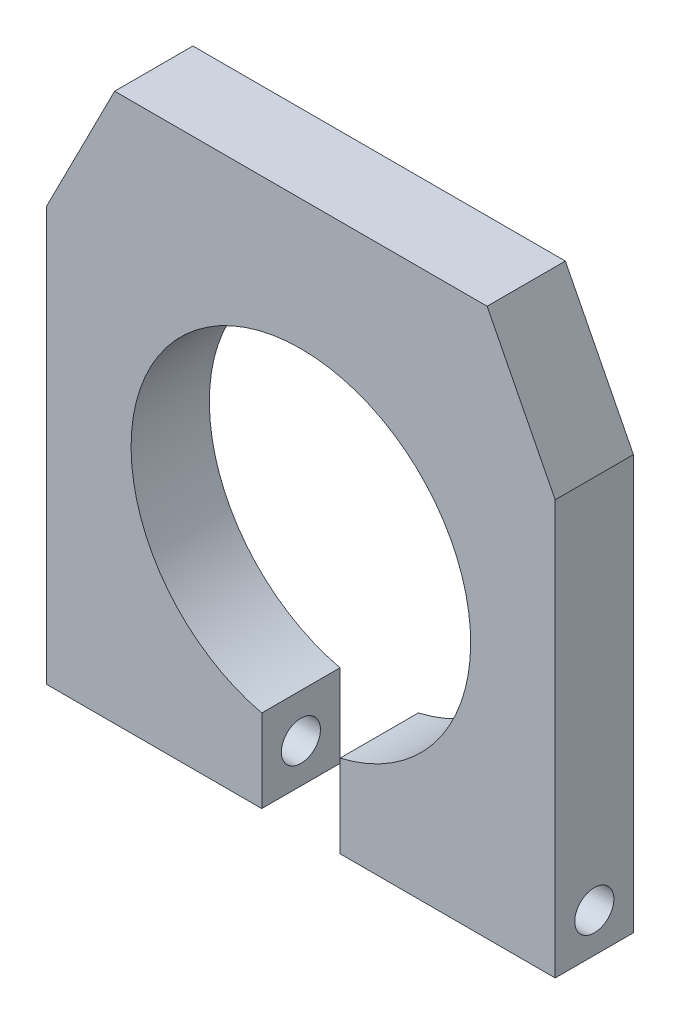
ISO-10303-21;
HEADER;
FILE_DESCRIPTION(('STEP AP214'),'2;1');
FILE_NAME('part.step','',(''),(''),'','','');
FILE_SCHEMA(('AUTOMOTIVE_DESIGN { 1 0 10303 214 1 1 1 1 }'));
ENDSEC;
DATA;
#1=APPLICATION_CONTEXT('core data for automotive mechanical design processes');
#2=APPLICATION_PROTOCOL_DEFINITION('international standard','automotive_design',2000,#1);
#3=PRODUCT_CONTEXT('',#1,'mechanical');
#4=PRODUCT('Part','Part','',(#3));
#5=PRODUCT_RELATED_PRODUCT_CATEGORY('part','',(#4));
#6=PRODUCT_DEFINITION_FORMATION('','',#4);
#7=PRODUCT_DEFINITION_CONTEXT('part definition',#1,'design');
#8=PRODUCT_DEFINITION('design','',#6,#7);
#9=PRODUCT_DEFINITION_SHAPE('','',#8);
#10=(LENGTH_UNIT() NAMED_UNIT(*) SI_UNIT(.MILLI.,.METRE.));
#11=(NAMED_UNIT(*) PLANE_ANGLE_UNIT() SI_UNIT($,.RADIAN.));
#12=(NAMED_UNIT(*) SI_UNIT($,.STERADIAN.) SOLID_ANGLE_UNIT());
#13=UNCERTAINTY_MEASURE_WITH_UNIT(LENGTH_MEASURE(1.E-05),#10,'distance_accuracy_value','');
#14=(GEOMETRIC_REPRESENTATION_CONTEXT(3) GLOBAL_UNCERTAINTY_ASSIGNED_CONTEXT((#13)) GLOBAL_UNIT_ASSIGNED_CONTEXT((#10,
#11,#12)) REPRESENTATION_CONTEXT('',''));
#15=CARTESIAN_POINT('',(0.,0.,0.));
#16=DIRECTION('',(0.,0.,1.));
#17=DIRECTION('',(1.,0.,0.));
#18=AXIS2_PLACEMENT_3D('',#15,#16,#17);
#19=CARTESIAN_POINT('',(0.,0.,12.7));
#20=DIRECTION('',(1.,0.,0.));
#21=DIRECTION('',(0.,1.,0.));
#22=AXIS2_PLACEMENT_3D('',#19,#20,#21);
#23=PLANE('',#22);
#24=CARTESIAN_POINT('',(0.,-82.55,6.35));
#25=DIRECTION('',(1.,0.,0.));
#26=DIRECTION('',(0.,1.,0.));
#27=AXIS2_PLACEMENT_3D('',#24,#25,#26);
#28=CIRCLE('',#27,3.175);
#29=CARTESIAN_POINT('',(0.,-79.375,6.35));
#30=VERTEX_POINT('',#29);
#31=EDGE_CURVE('E196',#30,#30,#28,.T.);
#32=ORIENTED_EDGE('',*,*,#31,.T.);
#33=EDGE_LOOP('',(#32));
#34=FACE_BOUND('',#33,.T.);
#35=DIRECTION('',(0.,-1.,0.));
#36=VECTOR('',#35,1.);
#37=CARTESIAN_POINT('',(0.,0.,12.7));
#38=LINE('',#37,#36);
#39=CARTESIAN_POINT('',(0.,-21.6848834753268,12.7));
#40=VERTEX_POINT('',#39);
#41=CARTESIAN_POINT('',(0.,-88.9,12.7));
#42=VERTEX_POINT('',#41);
#43=EDGE_CURVE('E125',#40,#42,#38,.T.);
#44=ORIENTED_EDGE('',*,*,#43,.F.);
#45=DIRECTION('',(0.,0.,1.));
#46=VECTOR('',#45,1.);
#47=CARTESIAN_POINT('',(0.,-21.6848834753268,0.));
#48=LINE('',#47,#46);
#49=CARTESIAN_POINT('',(0.,-21.6848834753268,0.));
#50=VERTEX_POINT('',#49);
#51=EDGE_CURVE('E229',#50,#40,#48,.T.);
#52=ORIENTED_EDGE('',*,*,#51,.F.);
#53=DIRECTION('',(0.,-1.,0.));
#54=VECTOR('',#53,1.);
#55=CARTESIAN_POINT('',(0.,0.,0.));
#56=LINE('',#55,#54);
#57=CARTESIAN_POINT('',(0.,-88.9,0.));
#58=VERTEX_POINT('',#57);
#59=EDGE_CURVE('E164',#50,#58,#56,.T.);
#60=ORIENTED_EDGE('',*,*,#59,.T.);
#61=DIRECTION('',(0.,0.,-1.));
#62=VECTOR('',#61,1.);
#63=CARTESIAN_POINT('',(0.,-88.9,12.7));
#64=LINE('',#63,#62);
#65=EDGE_CURVE('E11',#42,#58,#64,.T.);
#66=ORIENTED_EDGE('',*,*,#65,.F.);
#67=EDGE_LOOP('',(#44,#52,#60,#66));
#68=FACE_BOUND('',#67,.T.);
#69=ADVANCED_FACE('F32',(#34,#68),#23,.F.);
#70=CARTESIAN_POINT('',(0.,-88.9,12.7));
#71=DIRECTION('',(0.,1.,0.));
#72=DIRECTION('',(0.,0.,1.));
#73=AXIS2_PLACEMENT_3D('',#70,#71,#72);
#74=PLANE('',#73);
#75=DIRECTION('',(1.,0.,0.));
#76=VECTOR('',#75,1.);
#77=CARTESIAN_POINT('',(0.,-88.9,0.));
#78=LINE('',#77,#76);
#79=CARTESIAN_POINT('',(34.925,-88.9,0.));
#80=VERTEX_POINT('',#79);
#81=EDGE_CURVE('E158',#58,#80,#78,.T.);
#82=ORIENTED_EDGE('',*,*,#81,.T.);
#83=DIRECTION('',(0.,0.,-1.));
#84=VECTOR('',#83,1.);
#85=CARTESIAN_POINT('',(34.925,-88.9,12.7));
#86=LINE('',#85,#84);
#87=CARTESIAN_POINT('',(34.925,-88.9,12.7));
#88=VERTEX_POINT('',#87);
#89=EDGE_CURVE('E39',#88,#80,#86,.T.);
#90=ORIENTED_EDGE('',*,*,#89,.F.);
#91=DIRECTION('',(1.,0.,0.));
#92=VECTOR('',#91,1.);
#93=CARTESIAN_POINT('',(0.,-88.9,12.7));
#94=LINE('',#93,#92);
#95=EDGE_CURVE('E128',#42,#88,#94,.T.);
#96=ORIENTED_EDGE('',*,*,#95,.F.);
#97=ORIENTED_EDGE('',*,*,#65,.T.);
#98=EDGE_LOOP('',(#82,#90,#96,#97));
#99=FACE_BOUND('',#98,.T.);
#100=ADVANCED_FACE('F219',(#99),#74,.F.);
#101=CARTESIAN_POINT('',(34.925,-88.9,12.7));
#102=DIRECTION('',(-1.,0.,0.));
#103=DIRECTION('',(0.,-1.,0.));
#104=AXIS2_PLACEMENT_3D('',#101,#102,#103);
#105=PLANE('',#104);
#106=CARTESIAN_POINT('',(34.925,-82.55,6.35));
#107=DIRECTION('',(-1.,0.,0.));
#108=DIRECTION('',(0.,-1.,0.));
#109=AXIS2_PLACEMENT_3D('',#106,#107,#108);
#110=CIRCLE('',#109,3.175);
#111=CARTESIAN_POINT('',(34.925,-85.725,6.35));
#112=VERTEX_POINT('',#111);
#113=EDGE_CURVE('E186',#112,#112,#110,.T.);
#114=ORIENTED_EDGE('',*,*,#113,.T.);
#115=EDGE_LOOP('',(#114));
#116=FACE_BOUND('',#115,.T.);
#117=DIRECTION('',(0.,1.,0.));
#118=VECTOR('',#117,1.);
#119=CARTESIAN_POINT('',(34.925,-88.9,0.));
#120=LINE('',#119,#118);
#121=CARTESIAN_POINT('',(34.925,-75.4584566467441,0.));
#122=VERTEX_POINT('',#121);
#123=EDGE_CURVE('E152',#80,#122,#120,.T.);
#124=ORIENTED_EDGE('',*,*,#123,.T.);
#125=DIRECTION('',(0.,0.,-1.));
#126=VECTOR('',#125,1.);
#127=CARTESIAN_POINT('',(34.925,-75.4584566467441,12.7));
#128=LINE('',#127,#126);
#129=CARTESIAN_POINT('',(34.925,-75.4584566467441,12.7));
#130=VERTEX_POINT('',#129);
#131=EDGE_CURVE('E143',#130,#122,#128,.T.);
#132=ORIENTED_EDGE('',*,*,#131,.F.);
#133=DIRECTION('',(0.,1.,0.));
#134=VECTOR('',#133,1.);
#135=CARTESIAN_POINT('',(34.925,-88.9,12.7));
#136=LINE('',#135,#134);
#137=EDGE_CURVE('E153',#88,#130,#136,.T.);
#138=ORIENTED_EDGE('',*,*,#137,.F.);
#139=ORIENTED_EDGE('',*,*,#89,.T.);
#140=EDGE_LOOP('',(#124,#132,#138,#139));
#141=FACE_BOUND('',#140,.T.);
#142=ADVANCED_FACE('F150',(#116,#141),#105,.F.);
#143=CARTESIAN_POINT('',(41.275,-48.641,12.7));
#144=DIRECTION('',(0.,0.,-1.));
#145=DIRECTION('',(-1.,0.,0.));
#146=AXIS2_PLACEMENT_3D('',#143,#144,#145);
#147=CYLINDRICAL_SURFACE('',#146,27.559);
#148=CARTESIAN_POINT('',(41.275,-48.641,0.));
#149=DIRECTION('',(0.,0.,-1.));
#150=DIRECTION('',(1.,0.,0.));
#151=AXIS2_PLACEMENT_3D('',#148,#149,#150);
#152=CIRCLE('',#151,27.559);
#153=CARTESIAN_POINT('',(47.625,-75.4584566467441,0.));
#154=VERTEX_POINT('',#153);
#155=EDGE_CURVE('E160',#122,#154,#152,.T.);
#156=ORIENTED_EDGE('',*,*,#155,.T.);
#157=DIRECTION('',(0.,0.,-1.));
#158=VECTOR('',#157,1.);
#159=CARTESIAN_POINT('',(47.625,-75.4584566467441,12.7));
#160=LINE('',#159,#158);
#161=CARTESIAN_POINT('',(47.625,-75.4584566467441,12.7));
#162=VERTEX_POINT('',#161);
#163=EDGE_CURVE('E140',#162,#154,#160,.T.);
#164=ORIENTED_EDGE('',*,*,#163,.F.);
#165=CARTESIAN_POINT('',(41.275,-48.641,12.7));
#166=DIRECTION('',(0.,0.,-1.));
#167=DIRECTION('',(1.,0.,0.));
#168=AXIS2_PLACEMENT_3D('',#165,#166,#167);
#169=CIRCLE('',#168,27.559);
#170=EDGE_CURVE('E202',#130,#162,#169,.T.);
#171=ORIENTED_EDGE('',*,*,#170,.F.);
#172=ORIENTED_EDGE('',*,*,#131,.T.);
#173=EDGE_LOOP('',(#156,#164,#171,#172));
#174=FACE_BOUND('',#173,.T.);
#175=ADVANCED_FACE('F210',(#174),#147,.F.);
#176=CARTESIAN_POINT('',(47.625,-75.4584566467441,12.7));
#177=DIRECTION('',(1.,0.,0.));
#178=DIRECTION('',(0.,1.,0.));
#179=AXIS2_PLACEMENT_3D('',#176,#177,#178);
#180=PLANE('',#179);
#181=CARTESIAN_POINT('',(47.625,-82.55,6.35));
#182=DIRECTION('',(1.,0.,0.));
#183=DIRECTION('',(0.,1.,0.));
#184=AXIS2_PLACEMENT_3D('',#181,#182,#183);
#185=CIRCLE('',#184,3.175);
#186=CARTESIAN_POINT('',(47.625,-79.375,6.35));
#187=VERTEX_POINT('',#186);
#188=EDGE_CURVE('E191',#187,#187,#185,.T.);
#189=ORIENTED_EDGE('',*,*,#188,.T.);
#190=EDGE_LOOP('',(#189));
#191=FACE_BOUND('',#190,.T.);
#192=DIRECTION('',(0.,-1.,0.));
#193=VECTOR('',#192,1.);
#194=CARTESIAN_POINT('',(47.625,-75.4584566467441,0.));
#195=LINE('',#194,#193);
#196=CARTESIAN_POINT('',(47.625,-88.9,0.));
#197=VERTEX_POINT('',#196);
#198=EDGE_CURVE('E162',#154,#197,#195,.T.);
#199=ORIENTED_EDGE('',*,*,#198,.T.);
#200=DIRECTION('',(0.,0.,-1.));
#201=VECTOR('',#200,1.);
#202=CARTESIAN_POINT('',(47.625,-88.9,12.7));
#203=LINE('',#202,#201);
#204=CARTESIAN_POINT('',(47.625,-88.9,12.7));
#205=VERTEX_POINT('',#204);
#206=EDGE_CURVE('E137',#205,#197,#203,.T.);
#207=ORIENTED_EDGE('',*,*,#206,.F.);
#208=DIRECTION('',(0.,-1.,0.));
#209=VECTOR('',#208,1.);
#210=CARTESIAN_POINT('',(47.625,-75.4584566467441,12.7));
#211=LINE('',#210,#209);
#212=EDGE_CURVE('E183',#162,#205,#211,.T.);
#213=ORIENTED_EDGE('',*,*,#212,.F.);
#214=ORIENTED_EDGE('',*,*,#163,.T.);
#215=EDGE_LOOP('',(#199,#207,#213,#214));
#216=FACE_BOUND('',#215,.T.);
#217=ADVANCED_FACE('F208',(#191,#216),#180,.F.);
#218=CARTESIAN_POINT('',(47.625,-88.9,12.7));
#219=DIRECTION('',(0.,1.,0.));
#220=DIRECTION('',(-1.,0.,0.));
#221=AXIS2_PLACEMENT_3D('',#218,#219,#220);
#222=PLANE('',#221);
#223=DIRECTION('',(1.,0.,0.));
#224=VECTOR('',#223,1.);
#225=CARTESIAN_POINT('',(47.625,-88.9,0.));
#226=LINE('',#225,#224);
#227=CARTESIAN_POINT('',(82.55,-88.9,0.));
#228=VERTEX_POINT('',#227);
#229=EDGE_CURVE('E130',#197,#228,#226,.T.);
#230=ORIENTED_EDGE('',*,*,#229,.T.);
#231=DIRECTION('',(0.,0.,-1.));
#232=VECTOR('',#231,1.);
#233=CARTESIAN_POINT('',(82.55,-88.9,12.7));
#234=LINE('',#233,#232);
#235=CARTESIAN_POINT('',(82.55,-88.9,12.7));
#236=VERTEX_POINT('',#235);
#237=EDGE_CURVE('E134',#236,#228,#234,.T.);
#238=ORIENTED_EDGE('',*,*,#237,.F.);
#239=DIRECTION('',(1.,0.,0.));
#240=VECTOR('',#239,1.);
#241=CARTESIAN_POINT('',(47.625,-88.9,12.7));
#242=LINE('',#241,#240);
#243=EDGE_CURVE('E180',#205,#236,#242,.T.);
#244=ORIENTED_EDGE('',*,*,#243,.F.);
#245=ORIENTED_EDGE('',*,*,#206,.T.);
#246=EDGE_LOOP('',(#230,#238,#244,#245));
#247=FACE_BOUND('',#246,.T.);
#248=ADVANCED_FACE('F171',(#247),#222,.F.);
#249=CARTESIAN_POINT('',(82.55,0.,12.7));
#250=DIRECTION('',(-1.,0.,0.));
#251=DIRECTION('',(0.,-1.,0.));
#252=AXIS2_PLACEMENT_3D('',#249,#250,#251);
#253=PLANE('',#252);
#254=CARTESIAN_POINT('',(82.55,-82.55,6.35));
#255=DIRECTION('',(1.,0.,0.));
#256=DIRECTION('',(0.,1.,0.));
#257=AXIS2_PLACEMENT_3D('',#254,#255,#256);
#258=CIRCLE('',#257,3.175);
#259=CARTESIAN_POINT('',(82.55,-79.375,6.35));
#260=VERTEX_POINT('',#259);
#261=EDGE_CURVE('E239',#260,#260,#258,.T.);
#262=ORIENTED_EDGE('',*,*,#261,.F.);
#263=EDGE_LOOP('',(#262));
#264=FACE_BOUND('',#263,.T.);
#265=DIRECTION('',(0.,1.,0.));
#266=VECTOR('',#265,1.);
#267=CARTESIAN_POINT('',(82.55,0.,0.));
#268=LINE('',#267,#266);
#269=CARTESIAN_POINT('',(82.55,-21.6848834753268,0.));
#270=VERTEX_POINT('',#269);
#271=EDGE_CURVE('E126',#228,#270,#268,.T.);
#272=ORIENTED_EDGE('',*,*,#271,.T.);
#273=DIRECTION('',(0.,0.,1.));
#274=VECTOR('',#273,1.);
#275=CARTESIAN_POINT('',(82.55,-21.6848834753268,0.));
#276=LINE('',#275,#274);
#277=CARTESIAN_POINT('',(82.55,-21.6848834753268,12.7));
#278=VERTEX_POINT('',#277);
#279=EDGE_CURVE('E46',#270,#278,#276,.T.);
#280=ORIENTED_EDGE('',*,*,#279,.T.);
#281=DIRECTION('',(0.,1.,0.));
#282=VECTOR('',#281,1.);
#283=CARTESIAN_POINT('',(82.55,0.,12.7));
#284=LINE('',#283,#282);
#285=EDGE_CURVE('E178',#236,#278,#284,.T.);
#286=ORIENTED_EDGE('',*,*,#285,.F.);
#287=ORIENTED_EDGE('',*,*,#237,.T.);
#288=EDGE_LOOP('',(#272,#280,#286,#287));
#289=FACE_BOUND('',#288,.T.);
#290=ADVANCED_FACE('F176',(#264,#289),#253,.F.);
#291=CARTESIAN_POINT('',(0.,0.,12.7));
#292=DIRECTION('',(0.,-1.,0.));
#293=DIRECTION('',(0.,0.,-1.));
#294=AXIS2_PLACEMENT_3D('',#291,#292,#293);
#295=PLANE('',#294);
#296=DIRECTION('',(-1.,0.,0.));
#297=VECTOR('',#296,1.);
#298=CARTESIAN_POINT('',(0.,0.,12.7));
#299=LINE('',#298,#297);
#300=CARTESIAN_POINT('',(71.501,0.,12.7));
#301=VERTEX_POINT('',#300);
#302=CARTESIAN_POINT('',(11.049,0.,12.7));
#303=VERTEX_POINT('',#302);
#304=EDGE_CURVE('E118',#301,#303,#299,.T.);
#305=ORIENTED_EDGE('',*,*,#304,.F.);
#306=DIRECTION('',(0.,0.,1.));
#307=VECTOR('',#306,1.);
#308=CARTESIAN_POINT('',(71.501,0.,0.));
#309=LINE('',#308,#307);
#310=CARTESIAN_POINT('',(71.501,0.,0.));
#311=VERTEX_POINT('',#310);
#312=EDGE_CURVE('E109',#311,#301,#309,.T.);
#313=ORIENTED_EDGE('',*,*,#312,.F.);
#314=DIRECTION('',(-1.,0.,0.));
#315=VECTOR('',#314,1.);
#316=CARTESIAN_POINT('',(0.,0.,0.));
#317=LINE('',#316,#315);
#318=CARTESIAN_POINT('',(11.049,0.,0.));
#319=VERTEX_POINT('',#318);
#320=EDGE_CURVE('E54',#311,#319,#317,.T.);
#321=ORIENTED_EDGE('',*,*,#320,.T.);
#322=DIRECTION('',(0.,0.,1.));
#323=VECTOR('',#322,1.);
#324=CARTESIAN_POINT('',(11.049,0.,0.));
#325=LINE('',#324,#323);
#326=EDGE_CURVE('E237',#319,#303,#325,.T.);
#327=ORIENTED_EDGE('',*,*,#326,.T.);
#328=EDGE_LOOP('',(#305,#313,#321,#327));
#329=FACE_BOUND('',#328,.T.);
#330=ADVANCED_FACE('F117',(#329),#295,.F.);
#331=CARTESIAN_POINT('',(41.275,-48.641,12.7));
#332=DIRECTION('',(0.,0.,1.));
#333=DIRECTION('',(1.,0.,0.));
#334=AXIS2_PLACEMENT_3D('',#331,#332,#333);
#335=PLANE('',#334);
#336=DIRECTION('',(0.453990499739541,-0.891006524188371,0.));
#337=VECTOR('',#336,1.);
#338=CARTESIAN_POINT('',(82.55,-21.6848834753268,12.7));
#339=LINE('',#338,#337);
#340=EDGE_CURVE('E114',#301,#278,#339,.T.);
#341=ORIENTED_EDGE('',*,*,#340,.F.);
#342=ORIENTED_EDGE('',*,*,#304,.T.);
#343=DIRECTION('',(0.453990499739541,0.891006524188371,0.));
#344=VECTOR('',#343,1.);
#345=CARTESIAN_POINT('',(11.049,0.,12.7));
#346=LINE('',#345,#344);
#347=EDGE_CURVE('E119',#40,#303,#346,.T.);
#348=ORIENTED_EDGE('',*,*,#347,.F.);
#349=ORIENTED_EDGE('',*,*,#43,.T.);
#350=ORIENTED_EDGE('',*,*,#95,.T.);
#351=ORIENTED_EDGE('',*,*,#137,.T.);
#352=ORIENTED_EDGE('',*,*,#170,.T.);
#353=ORIENTED_EDGE('',*,*,#212,.T.);
#354=ORIENTED_EDGE('',*,*,#243,.T.);
#355=ORIENTED_EDGE('',*,*,#285,.T.);
#356=EDGE_LOOP('',(#341,#342,#348,#349,#350,#351,#352,#353,#354,#355));
#357=FACE_BOUND('',#356,.T.);
#358=ADVANCED_FACE('F204',(#357),#335,.T.);
#359=CARTESIAN_POINT('',(41.275,-48.641,0.));
#360=DIRECTION('',(0.,0.,1.));
#361=DIRECTION('',(1.,0.,0.));
#362=AXIS2_PLACEMENT_3D('',#359,#360,#361);
#363=PLANE('',#362);
#364=ORIENTED_EDGE('',*,*,#320,.F.);
#365=DIRECTION('',(0.453990499739541,-0.891006524188371,0.));
#366=VECTOR('',#365,1.);
#367=CARTESIAN_POINT('',(82.55,-21.6848834753268,0.));
#368=LINE('',#367,#366);
#369=EDGE_CURVE('E107',#311,#270,#368,.T.);
#370=ORIENTED_EDGE('',*,*,#369,.T.);
#371=ORIENTED_EDGE('',*,*,#271,.F.);
#372=ORIENTED_EDGE('',*,*,#229,.F.);
#373=ORIENTED_EDGE('',*,*,#198,.F.);
#374=ORIENTED_EDGE('',*,*,#155,.F.);
#375=ORIENTED_EDGE('',*,*,#123,.F.);
#376=ORIENTED_EDGE('',*,*,#81,.F.);
#377=ORIENTED_EDGE('',*,*,#59,.F.);
#378=DIRECTION('',(0.453990499739541,0.891006524188371,0.));
#379=VECTOR('',#378,1.);
#380=CARTESIAN_POINT('',(11.049,0.,0.));
#381=LINE('',#380,#379);
#382=EDGE_CURVE('E124',#50,#319,#381,.T.);
#383=ORIENTED_EDGE('',*,*,#382,.T.);
#384=EDGE_LOOP('',(#364,#370,#371,#372,#373,#374,#375,#376,#377,#383));
#385=FACE_BOUND('',#384,.T.);
#386=ADVANCED_FACE('F122',(#385),#363,.F.);
#387=CARTESIAN_POINT('',(0.,-82.55,6.35));
#388=DIRECTION('',(1.,0.,0.));
#389=DIRECTION('',(0.,1.,0.));
#390=AXIS2_PLACEMENT_3D('',#387,#388,#389);
#391=CYLINDRICAL_SURFACE('',#390,3.175);
#392=ORIENTED_EDGE('',*,*,#261,.T.);
#393=EDGE_LOOP('',(#392));
#394=FACE_BOUND('',#393,.T.);
#395=ORIENTED_EDGE('',*,*,#188,.F.);
#396=EDGE_LOOP('',(#395));
#397=FACE_BOUND('',#396,.T.);
#398=ADVANCED_FACE('F244',(#394,#397),#391,.F.);
#399=ORIENTED_EDGE('',*,*,#31,.F.);
#400=EDGE_LOOP('',(#399));
#401=FACE_BOUND('',#400,.T.);
#402=ORIENTED_EDGE('',*,*,#113,.F.);
#403=EDGE_LOOP('',(#402));
#404=FACE_BOUND('',#403,.T.);
#405=ADVANCED_FACE('F260',(#401,#404),#391,.F.);
#406=CARTESIAN_POINT('',(11.049,0.,0.));
#407=DIRECTION('',(0.891006524188371,-0.453990499739541,0.));
#408=DIRECTION('',(0.453990499739541,0.891006524188371,0.));
#409=AXIS2_PLACEMENT_3D('',#406,#407,#408);
#410=PLANE('',#409);
#411=ORIENTED_EDGE('',*,*,#347,.T.);
#412=ORIENTED_EDGE('',*,*,#326,.F.);
#413=ORIENTED_EDGE('',*,*,#382,.F.);
#414=ORIENTED_EDGE('',*,*,#51,.T.);
#415=EDGE_LOOP('',(#411,#412,#413,#414));
#416=FACE_BOUND('',#415,.T.);
#417=ADVANCED_FACE('F263',(#416),#410,.F.);
#418=CARTESIAN_POINT('',(82.55,-21.6848834753268,0.));
#419=DIRECTION('',(-0.891006524188371,-0.453990499739541,0.));
#420=DIRECTION('',(0.453990499739541,-0.891006524188371,0.));
#421=AXIS2_PLACEMENT_3D('',#418,#419,#420);
#422=PLANE('',#421);
#423=ORIENTED_EDGE('',*,*,#340,.T.);
#424=ORIENTED_EDGE('',*,*,#279,.F.);
#425=ORIENTED_EDGE('',*,*,#369,.F.);
#426=ORIENTED_EDGE('',*,*,#312,.T.);
#427=EDGE_LOOP('',(#423,#424,#425,#426));
#428=FACE_BOUND('',#427,.T.);
#429=ADVANCED_FACE('F108',(#428),#422,.F.);
#430=CLOSED_SHELL('',(#69,#100,#142,#175,#217,#248,#290,#330,#358,#386,#398,#405,#417,#429));
#431=MANIFOLD_SOLID_BREP('B2',#430);
#432=ADVANCED_BREP_SHAPE_REPRESENTATION('',(#18,#431),#14);
#433=SHAPE_DEFINITION_REPRESENTATION(#9,#432);
ENDSEC;
END-ISO-10303-21;
